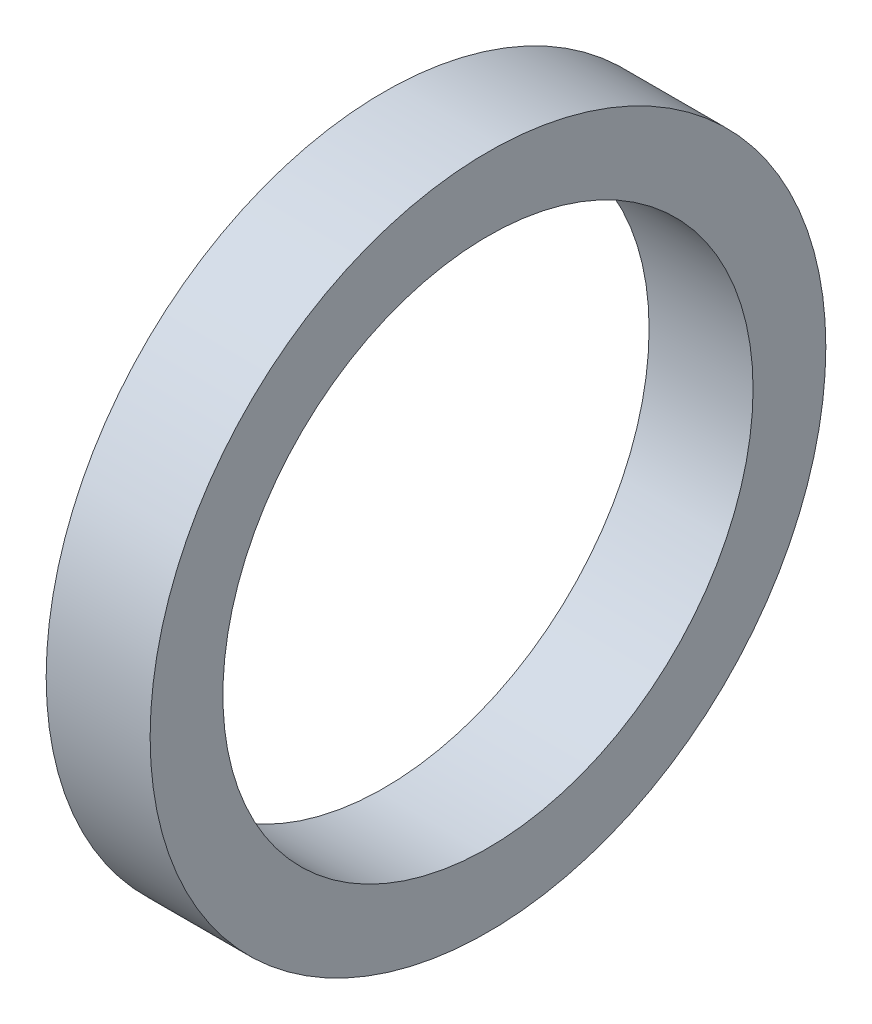
ISO-10303-21;
HEADER;
FILE_DESCRIPTION(('STEP AP214'),'2;1');
FILE_NAME('part.step','',(''),(''),'','','');
FILE_SCHEMA(('AUTOMOTIVE_DESIGN { 1 0 10303 214 1 1 1 1 }'));
ENDSEC;
DATA;
#1=APPLICATION_CONTEXT('core data for automotive mechanical design processes');
#2=APPLICATION_PROTOCOL_DEFINITION('international standard','automotive_design',2000,#1);
#3=PRODUCT_CONTEXT('',#1,'mechanical');
#4=PRODUCT('Part','Part','',(#3));
#5=PRODUCT_RELATED_PRODUCT_CATEGORY('part','',(#4));
#6=PRODUCT_DEFINITION_FORMATION('','',#4);
#7=PRODUCT_DEFINITION_CONTEXT('part definition',#1,'design');
#8=PRODUCT_DEFINITION('design','',#6,#7);
#9=PRODUCT_DEFINITION_SHAPE('','',#8);
#10=(LENGTH_UNIT() NAMED_UNIT(*) SI_UNIT(.MILLI.,.METRE.));
#11=(NAMED_UNIT(*) PLANE_ANGLE_UNIT() SI_UNIT($,.RADIAN.));
#12=(NAMED_UNIT(*) SI_UNIT($,.STERADIAN.) SOLID_ANGLE_UNIT());
#13=UNCERTAINTY_MEASURE_WITH_UNIT(LENGTH_MEASURE(1.E-05),#10,'distance_accuracy_value','');
#14=(GEOMETRIC_REPRESENTATION_CONTEXT(3) GLOBAL_UNCERTAINTY_ASSIGNED_CONTEXT((#13)) GLOBAL_UNIT_ASSIGNED_CONTEXT((#10,
#11,#12)) REPRESENTATION_CONTEXT('',''));
#15=CARTESIAN_POINT('',(0.,0.,0.));
#16=DIRECTION('',(0.,0.,1.));
#17=DIRECTION('',(1.,0.,0.));
#18=AXIS2_PLACEMENT_3D('',#15,#16,#17);
#19=CARTESIAN_POINT('',(0.004500000000007,6.5045,6.5045));
#20=DIRECTION('',(1.,0.,0.));
#21=DIRECTION('',(0.,0.,-1.));
#22=AXIS2_PLACEMENT_3D('',#19,#20,#21);
#23=CYLINDRICAL_SURFACE('',#22,5.1);
#24=CARTESIAN_POINT('',(0.004500000000007,6.5045,6.5045));
#25=DIRECTION('',(1.,0.,0.));
#26=DIRECTION('',(0.,0.,-1.));
#27=AXIS2_PLACEMENT_3D('',#24,#25,#26);
#28=CIRCLE('',#27,5.1);
#29=CARTESIAN_POINT('',(0.004500000000007,6.5045,1.4045));
#30=VERTEX_POINT('',#29);
#31=EDGE_CURVE('E26',#30,#30,#28,.F.);
#32=ORIENTED_EDGE('',*,*,#31,.T.);
#33=EDGE_LOOP('',(#32));
#34=FACE_BOUND('',#33,.T.);
#35=CARTESIAN_POINT('',(2.0045,6.5045,6.5045));
#36=DIRECTION('',(1.,0.,0.));
#37=DIRECTION('',(0.,0.,-1.));
#38=AXIS2_PLACEMENT_3D('',#35,#36,#37);
#39=CIRCLE('',#38,5.1);
#40=CARTESIAN_POINT('',(2.0045,6.5045,1.4045));
#41=VERTEX_POINT('',#40);
#42=EDGE_CURVE('E17',#41,#41,#39,.F.);
#43=ORIENTED_EDGE('',*,*,#42,.F.);
#44=EDGE_LOOP('',(#43));
#45=FACE_BOUND('',#44,.T.);
#46=ADVANCED_FACE('F14',(#34,#45),#23,.F.);
#47=CARTESIAN_POINT('',(2.0045,6.5045,6.5045));
#48=DIRECTION('',(1.,0.,0.));
#49=DIRECTION('',(0.,0.,-1.));
#50=AXIS2_PLACEMENT_3D('',#47,#48,#49);
#51=PLANE('',#50);
#52=ORIENTED_EDGE('',*,*,#42,.T.);
#53=EDGE_LOOP('',(#52));
#54=FACE_BOUND('',#53,.T.);
#55=CARTESIAN_POINT('',(2.0045,6.5045,6.5045));
#56=DIRECTION('',(1.,0.,0.));
#57=DIRECTION('',(0.,0.,-1.));
#58=AXIS2_PLACEMENT_3D('',#55,#56,#57);
#59=CIRCLE('',#58,6.5);
#60=CARTESIAN_POINT('',(2.0045,6.5045,0.00450000000000016));
#61=VERTEX_POINT('',#60);
#62=EDGE_CURVE('E21',#61,#61,#59,.F.);
#63=ORIENTED_EDGE('',*,*,#62,.F.);
#64=EDGE_LOOP('',(#63));
#65=FACE_BOUND('',#64,.T.);
#66=ADVANCED_FACE('F34',(#54,#65),#51,.T.);
#67=CARTESIAN_POINT('',(0.004500000000007,6.5045,6.5045));
#68=DIRECTION('',(1.,0.,0.));
#69=DIRECTION('',(0.,0.,-1.));
#70=AXIS2_PLACEMENT_3D('',#67,#68,#69);
#71=PLANE('',#70);
#72=ORIENTED_EDGE('',*,*,#31,.F.);
#73=EDGE_LOOP('',(#72));
#74=FACE_BOUND('',#73,.T.);
#75=CARTESIAN_POINT('',(0.004500000000007,6.5045,6.5045));
#76=DIRECTION('',(1.,0.,0.));
#77=DIRECTION('',(0.,0.,-1.));
#78=AXIS2_PLACEMENT_3D('',#75,#76,#77);
#79=CIRCLE('',#78,6.5);
#80=CARTESIAN_POINT('',(0.004500000000007,6.5045,0.00450000000000016));
#81=VERTEX_POINT('',#80);
#82=EDGE_CURVE('E10',#81,#81,#79,.T.);
#83=ORIENTED_EDGE('',*,*,#82,.F.);
#84=EDGE_LOOP('',(#83));
#85=FACE_BOUND('',#84,.T.);
#86=ADVANCED_FACE('F42',(#74,#85),#71,.F.);
#87=CARTESIAN_POINT('',(0.004500000000007,6.5045,6.5045));
#88=DIRECTION('',(1.,0.,0.));
#89=DIRECTION('',(0.,0.,-1.));
#90=AXIS2_PLACEMENT_3D('',#87,#88,#89);
#91=CYLINDRICAL_SURFACE('',#90,6.5);
#92=ORIENTED_EDGE('',*,*,#82,.T.);
#93=EDGE_LOOP('',(#92));
#94=FACE_BOUND('',#93,.T.);
#95=ORIENTED_EDGE('',*,*,#62,.T.);
#96=EDGE_LOOP('',(#95));
#97=FACE_BOUND('',#96,.T.);
#98=ADVANCED_FACE('F43',(#94,#97),#91,.T.);
#99=CLOSED_SHELL('',(#46,#66,#86,#98));
#100=MANIFOLD_SOLID_BREP('B1',#99);
#101=ADVANCED_BREP_SHAPE_REPRESENTATION('',(#18,#100),#14);
#102=SHAPE_DEFINITION_REPRESENTATION(#9,#101);
ENDSEC;
END-ISO-10303-21;
